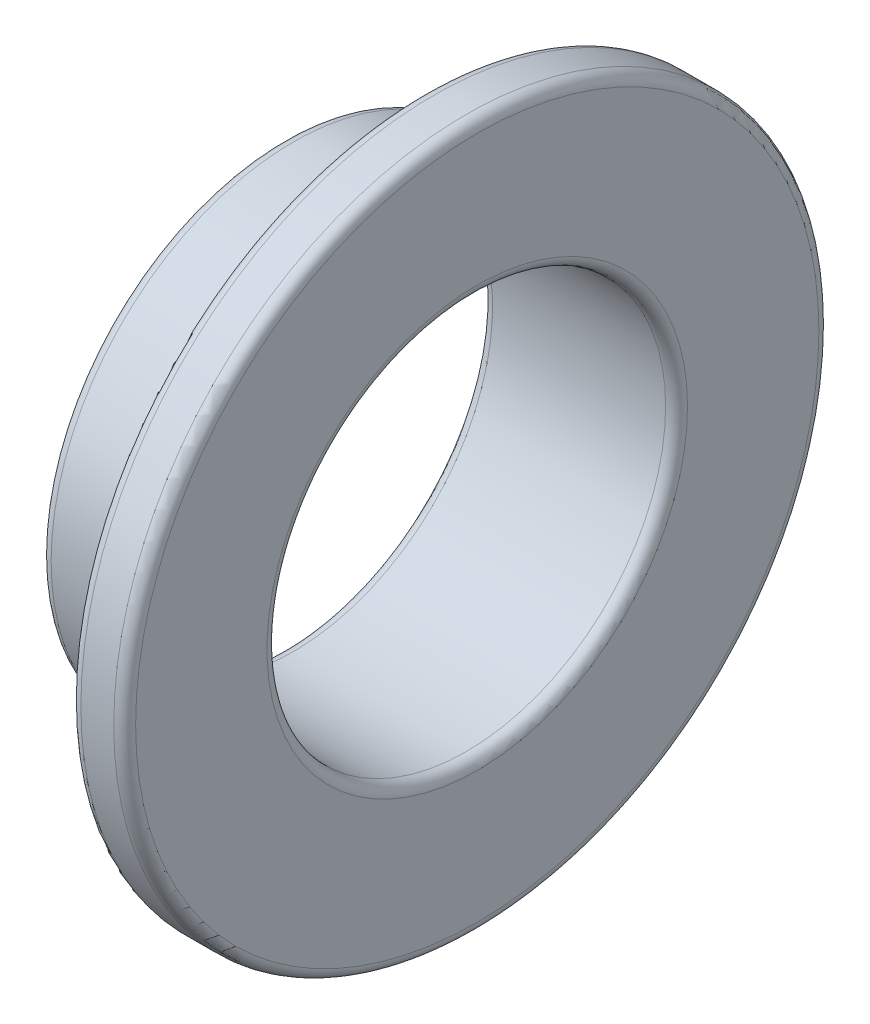
ISO-10303-21;
HEADER;
FILE_DESCRIPTION(('STEP AP214'),'2;1');
FILE_NAME('part.step','',(''),(''),'','','');
FILE_SCHEMA(('AUTOMOTIVE_DESIGN { 1 0 10303 214 1 1 1 1 }'));
ENDSEC;
DATA;
#1=APPLICATION_CONTEXT('core data for automotive mechanical design processes');
#2=APPLICATION_PROTOCOL_DEFINITION('international standard','automotive_design',2000,#1);
#3=PRODUCT_CONTEXT('',#1,'mechanical');
#4=PRODUCT('Part','Part','',(#3));
#5=PRODUCT_RELATED_PRODUCT_CATEGORY('part','',(#4));
#6=PRODUCT_DEFINITION_FORMATION('','',#4);
#7=PRODUCT_DEFINITION_CONTEXT('part definition',#1,'design');
#8=PRODUCT_DEFINITION('design','',#6,#7);
#9=PRODUCT_DEFINITION_SHAPE('','',#8);
#10=(LENGTH_UNIT() NAMED_UNIT(*) SI_UNIT(.MILLI.,.METRE.));
#11=(NAMED_UNIT(*) PLANE_ANGLE_UNIT() SI_UNIT($,.RADIAN.));
#12=(NAMED_UNIT(*) SI_UNIT($,.STERADIAN.) SOLID_ANGLE_UNIT());
#13=UNCERTAINTY_MEASURE_WITH_UNIT(LENGTH_MEASURE(1.E-05),#10,'distance_accuracy_value','');
#14=(GEOMETRIC_REPRESENTATION_CONTEXT(3) GLOBAL_UNCERTAINTY_ASSIGNED_CONTEXT((#13)) GLOBAL_UNIT_ASSIGNED_CONTEXT((#10,
#11,#12)) REPRESENTATION_CONTEXT('',''));
#15=CARTESIAN_POINT('',(0.,0.,0.));
#16=DIRECTION('',(0.,0.,1.));
#17=DIRECTION('',(1.,0.,0.));
#18=AXIS2_PLACEMENT_3D('',#15,#16,#17);
#19=CARTESIAN_POINT('',(10.,0.,0.));
#20=DIRECTION('',(-1.,0.,0.));
#21=DIRECTION('',(0.,0.,1.));
#22=AXIS2_PLACEMENT_3D('',#19,#20,#21);
#23=PLANE('',#22);
#24=CARTESIAN_POINT('',(10.,0.,0.));
#25=DIRECTION('',(-1.,0.,0.));
#26=DIRECTION('',(0.,0.,1.));
#27=AXIS2_PLACEMENT_3D('',#24,#25,#26);
#28=CIRCLE('',#27,11.56);
#29=CARTESIAN_POINT('',(10.,0.,11.56));
#30=VERTEX_POINT('',#29);
#31=EDGE_CURVE('E44',#30,#30,#28,.F.);
#32=ORIENTED_EDGE('',*,*,#31,.T.);
#33=EDGE_LOOP('',(#32));
#34=FACE_BOUND('',#33,.T.);
#35=CARTESIAN_POINT('',(10.,0.,0.));
#36=DIRECTION('',(-1.,0.,0.));
#37=DIRECTION('',(0.,0.,1.));
#38=AXIS2_PLACEMENT_3D('',#35,#36,#37);
#39=CIRCLE('',#38,15.6);
#40=CARTESIAN_POINT('',(10.,0.,15.6));
#41=VERTEX_POINT('',#40);
#42=EDGE_CURVE('E48',#41,#41,#39,.T.);
#43=ORIENTED_EDGE('',*,*,#42,.T.);
#44=EDGE_LOOP('',(#43));
#45=FACE_BOUND('',#44,.T.);
#46=ADVANCED_FACE('F33',(#34,#45),#23,.T.);
#47=CARTESIAN_POINT('',(-30.8496386192104,0.,0.));
#48=DIRECTION('',(-1.,0.,0.));
#49=DIRECTION('',(0.,0.,1.));
#50=AXIS2_PLACEMENT_3D('',#47,#48,#49);
#51=CYLINDRICAL_SURFACE('',#50,11.06);
#52=CARTESIAN_POINT('',(4.1,0.,0.));
#53=DIRECTION('',(-1.,0.,0.));
#54=DIRECTION('',(0.,0.,1.));
#55=AXIS2_PLACEMENT_3D('',#52,#53,#54);
#56=CIRCLE('',#55,11.06);
#57=CARTESIAN_POINT('',(4.1,0.,11.06));
#58=VERTEX_POINT('',#57);
#59=EDGE_CURVE('E53',#58,#58,#56,.F.);
#60=ORIENTED_EDGE('',*,*,#59,.T.);
#61=EDGE_LOOP('',(#60));
#62=FACE_BOUND('',#61,.T.);
#63=CARTESIAN_POINT('',(9.5,0.,0.));
#64=DIRECTION('',(-1.,0.,0.));
#65=DIRECTION('',(0.,0.,1.));
#66=AXIS2_PLACEMENT_3D('',#63,#64,#65);
#67=CIRCLE('',#66,11.06);
#68=CARTESIAN_POINT('',(9.5,0.,11.06));
#69=VERTEX_POINT('',#68);
#70=EDGE_CURVE('E56',#69,#69,#67,.T.);
#71=ORIENTED_EDGE('',*,*,#70,.T.);
#72=EDGE_LOOP('',(#71));
#73=FACE_BOUND('',#72,.T.);
#74=ADVANCED_FACE('F89',(#62,#73),#51,.T.);
#75=CARTESIAN_POINT('',(3.6,0.,0.));
#76=DIRECTION('',(-1.,0.,0.));
#77=DIRECTION('',(0.,0.,1.));
#78=AXIS2_PLACEMENT_3D('',#75,#76,#77);
#79=PLANE('',#78);
#80=CARTESIAN_POINT('',(3.6,0.,0.));
#81=DIRECTION('',(-1.,0.,0.));
#82=DIRECTION('',(0.,0.,1.));
#83=AXIS2_PLACEMENT_3D('',#80,#81,#82);
#84=CIRCLE('',#83,10.56);
#85=CARTESIAN_POINT('',(3.6,0.,10.56));
#86=VERTEX_POINT('',#85);
#87=EDGE_CURVE('E59',#86,#86,#84,.T.);
#88=ORIENTED_EDGE('',*,*,#87,.T.);
#89=EDGE_LOOP('',(#88));
#90=FACE_BOUND('',#89,.T.);
#91=CARTESIAN_POINT('',(3.6,0.,0.));
#92=DIRECTION('',(-1.,0.,0.));
#93=DIRECTION('',(0.,0.,1.));
#94=AXIS2_PLACEMENT_3D('',#91,#92,#93);
#95=CIRCLE('',#94,9.6);
#96=CARTESIAN_POINT('',(3.6,0.,9.6));
#97=VERTEX_POINT('',#96);
#98=EDGE_CURVE('E62',#97,#97,#95,.F.);
#99=ORIENTED_EDGE('',*,*,#98,.T.);
#100=EDGE_LOOP('',(#99));
#101=FACE_BOUND('',#100,.T.);
#102=ADVANCED_FACE('F95',(#90,#101),#79,.T.);
#103=CARTESIAN_POINT('',(-30.8496386192104,0.,0.));
#104=DIRECTION('',(-1.,0.,0.));
#105=DIRECTION('',(0.,0.,1.));
#106=AXIS2_PLACEMENT_3D('',#103,#104,#105);
#107=CYLINDRICAL_SURFACE('',#106,9.1);
#108=CARTESIAN_POINT('',(12.,0.,0.));
#109=DIRECTION('',(1.,0.,0.));
#110=DIRECTION('',(0.,0.,-1.));
#111=AXIS2_PLACEMENT_3D('',#108,#109,#110);
#112=CIRCLE('',#111,9.1);
#113=CARTESIAN_POINT('',(12.,0.,-9.1));
#114=VERTEX_POINT('',#113);
#115=EDGE_CURVE('E10',#114,#114,#112,.T.);
#116=ORIENTED_EDGE('',*,*,#115,.T.);
#117=EDGE_LOOP('',(#116));
#118=FACE_BOUND('',#117,.T.);
#119=CARTESIAN_POINT('',(4.1,0.,0.));
#120=DIRECTION('',(-1.,0.,0.));
#121=DIRECTION('',(0.,0.,1.));
#122=AXIS2_PLACEMENT_3D('',#119,#120,#121);
#123=CIRCLE('',#122,9.1);
#124=CARTESIAN_POINT('',(4.1,0.,9.1));
#125=VERTEX_POINT('',#124);
#126=EDGE_CURVE('E40',#125,#125,#123,.T.);
#127=ORIENTED_EDGE('',*,*,#126,.T.);
#128=EDGE_LOOP('',(#127));
#129=FACE_BOUND('',#128,.T.);
#130=ADVANCED_FACE('F121',(#118,#129),#107,.F.);
#131=CARTESIAN_POINT('',(12.5,0.,0.));
#132=DIRECTION('',(1.,0.,0.));
#133=DIRECTION('',(0.,0.,-1.));
#134=AXIS2_PLACEMENT_3D('',#131,#132,#133);
#135=PLANE('',#134);
#136=CARTESIAN_POINT('',(12.5,0.,0.));
#137=DIRECTION('',(1.,0.,0.));
#138=DIRECTION('',(0.,0.,-1.));
#139=AXIS2_PLACEMENT_3D('',#136,#137,#138);
#140=CIRCLE('',#139,15.6);
#141=CARTESIAN_POINT('',(12.5,0.,-15.6));
#142=VERTEX_POINT('',#141);
#143=EDGE_CURVE('E65',#142,#142,#140,.T.);
#144=ORIENTED_EDGE('',*,*,#143,.T.);
#145=EDGE_LOOP('',(#144));
#146=FACE_BOUND('',#145,.T.);
#147=CARTESIAN_POINT('',(12.5,0.,0.));
#148=DIRECTION('',(1.,0.,0.));
#149=DIRECTION('',(0.,0.,-1.));
#150=AXIS2_PLACEMENT_3D('',#147,#148,#149);
#151=CIRCLE('',#150,9.6);
#152=CARTESIAN_POINT('',(12.5,0.,-9.6));
#153=VERTEX_POINT('',#152);
#154=EDGE_CURVE('E68',#153,#153,#151,.F.);
#155=ORIENTED_EDGE('',*,*,#154,.T.);
#156=EDGE_LOOP('',(#155));
#157=FACE_BOUND('',#156,.T.);
#158=ADVANCED_FACE('F119',(#146,#157),#135,.T.);
#159=CARTESIAN_POINT('',(-30.8496386192104,0.,0.));
#160=DIRECTION('',(-1.,0.,0.));
#161=DIRECTION('',(0.,0.,1.));
#162=AXIS2_PLACEMENT_3D('',#159,#160,#161);
#163=CYLINDRICAL_SURFACE('',#162,16.1);
#164=CARTESIAN_POINT('',(12.,0.,0.));
#165=DIRECTION('',(1.,0.,0.));
#166=DIRECTION('',(0.,0.,-1.));
#167=AXIS2_PLACEMENT_3D('',#164,#165,#166);
#168=CIRCLE('',#167,16.1);
#169=CARTESIAN_POINT('',(12.,0.,-16.1));
#170=VERTEX_POINT('',#169);
#171=EDGE_CURVE('E71',#170,#170,#168,.F.);
#172=ORIENTED_EDGE('',*,*,#171,.T.);
#173=EDGE_LOOP('',(#172));
#174=FACE_BOUND('',#173,.T.);
#175=CARTESIAN_POINT('',(10.5,0.,0.));
#176=DIRECTION('',(-1.,0.,0.));
#177=DIRECTION('',(0.,0.,1.));
#178=AXIS2_PLACEMENT_3D('',#175,#176,#177);
#179=CIRCLE('',#178,16.1);
#180=CARTESIAN_POINT('',(10.5,0.,16.1));
#181=VERTEX_POINT('',#180);
#182=EDGE_CURVE('E74',#181,#181,#179,.F.);
#183=ORIENTED_EDGE('',*,*,#182,.T.);
#184=EDGE_LOOP('',(#183));
#185=FACE_BOUND('',#184,.T.);
#186=ADVANCED_FACE('F78',(#174,#185),#163,.T.);
#187=CARTESIAN_POINT('',(12.,0.,0.));
#188=DIRECTION('',(1.,0.,0.));
#189=DIRECTION('',(0.,0.,-1.));
#190=AXIS2_PLACEMENT_3D('',#187,#188,#189);
#191=TOROIDAL_SURFACE('',#190,15.6,0.5);
#192=ORIENTED_EDGE('',*,*,#143,.F.);
#193=EDGE_LOOP('',(#192));
#194=FACE_BOUND('',#193,.T.);
#195=ORIENTED_EDGE('',*,*,#171,.F.);
#196=EDGE_LOOP('',(#195));
#197=FACE_BOUND('',#196,.T.);
#198=ADVANCED_FACE('F100',(#194,#197),#191,.T.);
#199=CARTESIAN_POINT('',(4.1,0.,0.));
#200=DIRECTION('',(-1.,0.,0.));
#201=DIRECTION('',(0.,0.,1.));
#202=AXIS2_PLACEMENT_3D('',#199,#200,#201);
#203=TOROIDAL_SURFACE('',#202,10.56,0.5);
#204=ORIENTED_EDGE('',*,*,#59,.F.);
#205=EDGE_LOOP('',(#204));
#206=FACE_BOUND('',#205,.T.);
#207=ORIENTED_EDGE('',*,*,#87,.F.);
#208=EDGE_LOOP('',(#207));
#209=FACE_BOUND('',#208,.T.);
#210=ADVANCED_FACE('F103',(#206,#209),#203,.T.);
#211=CARTESIAN_POINT('',(9.5,0.,0.));
#212=DIRECTION('',(-1.,0.,0.));
#213=DIRECTION('',(0.,0.,1.));
#214=AXIS2_PLACEMENT_3D('',#211,#212,#213);
#215=TOROIDAL_SURFACE('',#214,11.56,0.5);
#216=ORIENTED_EDGE('',*,*,#31,.F.);
#217=EDGE_LOOP('',(#216));
#218=FACE_BOUND('',#217,.T.);
#219=ORIENTED_EDGE('',*,*,#70,.F.);
#220=EDGE_LOOP('',(#219));
#221=FACE_BOUND('',#220,.T.);
#222=ADVANCED_FACE('F84',(#218,#221),#215,.F.);
#223=CARTESIAN_POINT('',(10.5,0.,0.));
#224=DIRECTION('',(-1.,0.,0.));
#225=DIRECTION('',(0.,0.,1.));
#226=AXIS2_PLACEMENT_3D('',#223,#224,#225);
#227=TOROIDAL_SURFACE('',#226,15.6,0.5);
#228=ORIENTED_EDGE('',*,*,#182,.F.);
#229=EDGE_LOOP('',(#228));
#230=FACE_BOUND('',#229,.T.);
#231=ORIENTED_EDGE('',*,*,#42,.F.);
#232=EDGE_LOOP('',(#231));
#233=FACE_BOUND('',#232,.T.);
#234=ADVANCED_FACE('F80',(#230,#233),#227,.T.);
#235=CARTESIAN_POINT('',(12.,0.,0.));
#236=DIRECTION('',(1.,0.,0.));
#237=DIRECTION('',(0.,0.,-1.));
#238=AXIS2_PLACEMENT_3D('',#235,#236,#237);
#239=TOROIDAL_SURFACE('',#238,9.6,0.5);
#240=ORIENTED_EDGE('',*,*,#115,.F.);
#241=EDGE_LOOP('',(#240));
#242=FACE_BOUND('',#241,.T.);
#243=ORIENTED_EDGE('',*,*,#154,.F.);
#244=EDGE_LOOP('',(#243));
#245=FACE_BOUND('',#244,.T.);
#246=ADVANCED_FACE('F83',(#242,#245),#239,.T.);
#247=CARTESIAN_POINT('',(4.1,0.,0.));
#248=DIRECTION('',(-1.,0.,0.));
#249=DIRECTION('',(0.,0.,1.));
#250=AXIS2_PLACEMENT_3D('',#247,#248,#249);
#251=TOROIDAL_SURFACE('',#250,9.6,0.5);
#252=ORIENTED_EDGE('',*,*,#98,.F.);
#253=EDGE_LOOP('',(#252));
#254=FACE_BOUND('',#253,.T.);
#255=ORIENTED_EDGE('',*,*,#126,.F.);
#256=EDGE_LOOP('',(#255));
#257=FACE_BOUND('',#256,.T.);
#258=ADVANCED_FACE('F35',(#254,#257),#251,.T.);
#259=CLOSED_SHELL('',(#46,#74,#102,#130,#158,#186,#198,#210,#222,#234,#246,#258));
#260=MANIFOLD_SOLID_BREP('B2',#259);
#261=ADVANCED_BREP_SHAPE_REPRESENTATION('',(#18,#260),#14);
#262=SHAPE_DEFINITION_REPRESENTATION(#9,#261);
ENDSEC;
END-ISO-10303-21;
